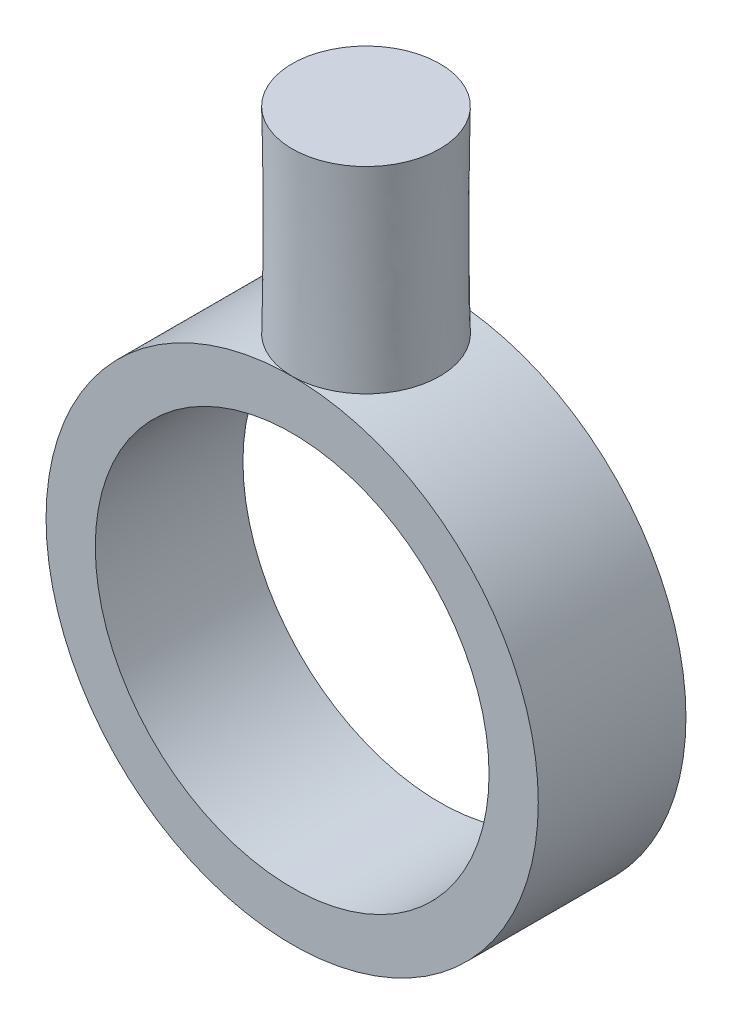
ISO-10303-21;
HEADER;
FILE_DESCRIPTION(('STEP AP214'),'2;1');
FILE_NAME('part.step','',(''),(''),'','','');
FILE_SCHEMA(('AUTOMOTIVE_DESIGN { 1 0 10303 214 1 1 1 1 }'));
ENDSEC;
DATA;
#1=APPLICATION_CONTEXT('core data for automotive mechanical design processes');
#2=APPLICATION_PROTOCOL_DEFINITION('international standard','automotive_design',2000,#1);
#3=PRODUCT_CONTEXT('',#1,'mechanical');
#4=PRODUCT('Part','Part','',(#3));
#5=PRODUCT_RELATED_PRODUCT_CATEGORY('part','',(#4));
#6=PRODUCT_DEFINITION_FORMATION('','',#4);
#7=PRODUCT_DEFINITION_CONTEXT('part definition',#1,'design');
#8=PRODUCT_DEFINITION('design','',#6,#7);
#9=PRODUCT_DEFINITION_SHAPE('','',#8);
#10=(LENGTH_UNIT() NAMED_UNIT(*) SI_UNIT(.MILLI.,.METRE.));
#11=(NAMED_UNIT(*) PLANE_ANGLE_UNIT() SI_UNIT($,.RADIAN.));
#12=(NAMED_UNIT(*) SI_UNIT($,.STERADIAN.) SOLID_ANGLE_UNIT());
#13=UNCERTAINTY_MEASURE_WITH_UNIT(LENGTH_MEASURE(1.E-05),#10,'distance_accuracy_value','');
#14=(GEOMETRIC_REPRESENTATION_CONTEXT(3) GLOBAL_UNCERTAINTY_ASSIGNED_CONTEXT((#13)) GLOBAL_UNIT_ASSIGNED_CONTEXT((#10,
#11,#12)) REPRESENTATION_CONTEXT('',''));
#15=CARTESIAN_POINT('',(0.,0.,0.));
#16=DIRECTION('',(0.,0.,1.));
#17=DIRECTION('',(1.,0.,0.));
#18=AXIS2_PLACEMENT_3D('',#15,#16,#17);
#19=CARTESIAN_POINT('',(0.,50.,15.));
#20=DIRECTION('',(0.,1.,0.));
#21=DIRECTION('',(0.,0.,1.));
#22=AXIS2_PLACEMENT_3D('',#19,#20,#21);
#23=PLANE('',#22);
#24=CARTESIAN_POINT('',(0.,50.,15.));
#25=DIRECTION('',(0.,1.,0.));
#26=DIRECTION('',(0.,0.,1.));
#27=AXIS2_PLACEMENT_3D('',#24,#25,#26);
#28=CIRCLE('',#27,15.);
#29=CARTESIAN_POINT('',(12.0178672783823,50.,6.02387243410683));
#30=VERTEX_POINT('',#29);
#31=EDGE_CURVE('E12',#30,#30,#28,.T.);
#32=ORIENTED_EDGE('',*,*,#31,.F.);
#33=EDGE_LOOP('',(#32));
#34=FACE_BOUND('',#33,.T.);
#35=ADVANCED_FACE('F47',(#34),#23,.F.);
#36=CARTESIAN_POINT('',(0.,90.,15.));
#37=DIRECTION('',(0.,1.,0.));
#38=DIRECTION('',(0.,0.,1.));
#39=AXIS2_PLACEMENT_3D('',#36,#37,#38);
#40=PLANE('',#39);
#41=CARTESIAN_POINT('',(0.,90.,15.));
#42=DIRECTION('',(0.,1.,0.));
#43=DIRECTION('',(0.,0.,1.));
#44=AXIS2_PLACEMENT_3D('',#41,#42,#43);
#45=CIRCLE('',#44,15.);
#46=CARTESIAN_POINT('',(8.36878401168276,90.,2.55156820455673));
#47=VERTEX_POINT('',#46);
#48=EDGE_CURVE('E55',#47,#47,#45,.T.);
#49=ORIENTED_EDGE('',*,*,#48,.T.);
#50=EDGE_LOOP('',(#49));
#51=FACE_BOUND('',#50,.T.);
#52=ADVANCED_FACE('F79',(#51),#40,.T.);
#53=CARTESIAN_POINT('',(8.36878401168276,90.,2.55156820455673));
#54=CARTESIAN_POINT('',(12.0178672783823,50.,6.02387243410683));
#55=CARTESIAN_POINT('',(33.2656476025693,90.,19.2891362279222));
#56=CARTESIAN_POINT('',(29.9701224101687,50.,30.0596069908715));
#57=CARTESIAN_POINT('',(16.5280795792038,90.,44.1859998188088));
#58=CARTESIAN_POINT('',(5.93438785340399,50.,48.0118621226578));
#59=CARTESIAN_POINT('',(-8.36878401168276,90.,27.4484317954433));
#60=CARTESIAN_POINT('',(-12.0178672783823,50.,23.9761275658932));
#61=CARTESIAN_POINT('',(-33.2656476025693,90.,10.7108637720778));
#62=CARTESIAN_POINT('',(-29.9701224101687,50.,-0.0596069908715031));
#63=CARTESIAN_POINT('',(-16.5280795792038,90.,-14.1859998188088));
#64=CARTESIAN_POINT('',(-5.934387853404,50.,-18.0118621226578));
#65=CARTESIAN_POINT('',(8.36878401168276,90.,2.55156820455673));
#66=CARTESIAN_POINT('',(12.0178672783823,50.,6.02387243410683));
#67=(BOUNDED_SURFACE() B_SPLINE_SURFACE(3,1,((#53,#54),(#55,#56),(#57,#58),(#59,#60),(#61,#62),
(#63,#64),(#65,#66)),.UNSPECIFIED.,.T.,.F.,.F.) B_SPLINE_SURFACE_WITH_KNOTS((4,3,4),(2,2),(0.,
0.5,1.),(0.,1.),.UNSPECIFIED.) GEOMETRIC_REPRESENTATION_ITEM() RATIONAL_B_SPLINE_SURFACE(((1.,
1.),(0.333333333333333,0.333333333333333),(0.333333333333333,0.333333333333333),(1.,1.),
(0.333333333333334,0.333333333333333),(0.333333333333334,0.333333333333333),(1.,1.))) REPRESENTATION_ITEM('') SURFACE());
#68=CARTESIAN_POINT('',(8.36878401168276,90.,2.55156820455673));
#69=CARTESIAN_POINT('',(8.40679529571088,89.5833333333333,2.58773804028121));
#70=CARTESIAN_POINT('',(8.444806579739,89.1666666666667,2.62390787600569));
#71=CARTESIAN_POINT('',(8.52082914779524,88.3333333333333,2.69624754745465));
#72=CARTESIAN_POINT('',(8.55884043182336,87.9166666666667,2.73241738317913));
#73=CARTESIAN_POINT('',(8.6348629998796,87.0833333333333,2.80475705462809));
#74=CARTESIAN_POINT('',(8.67287428390772,86.6666666666667,2.84092689035257));
#75=CARTESIAN_POINT('',(8.74889685196397,85.8333333333333,2.91326656180153));
#76=CARTESIAN_POINT('',(8.78690813599209,85.4166666666667,2.94943639752601));
#77=CARTESIAN_POINT('',(8.86293070404833,84.5833333333333,3.02177606897497));
#78=CARTESIAN_POINT('',(8.90094198807645,84.1666666666667,3.05794590469945));
#79=CARTESIAN_POINT('',(8.97696455613269,83.3333333333333,3.13028557614841));
#80=CARTESIAN_POINT('',(9.01497584016081,82.9166666666667,3.16645541187289));
#81=CARTESIAN_POINT('',(9.09099840821705,82.0833333333334,3.23879508332185));
#82=CARTESIAN_POINT('',(9.12900969224517,81.6666666666667,3.27496491904633));
#83=CARTESIAN_POINT('',(9.20503226030141,80.8333333333333,3.34730459049529));
#84=CARTESIAN_POINT('',(9.24304354432953,80.4166666666667,3.38347442621977));
#85=CARTESIAN_POINT('',(9.31906611238577,79.5833333333333,3.45581409766873));
#86=CARTESIAN_POINT('',(9.35707739641389,79.1666666666667,3.49198393339322));
#87=CARTESIAN_POINT('',(9.43309996447014,78.3333333333334,3.56432360484218));
#88=CARTESIAN_POINT('',(9.47111124849826,77.9166666666667,3.60049344056666));
#89=CARTESIAN_POINT('',(9.5471338165545,77.0833333333334,3.67283311201562));
#90=CARTESIAN_POINT('',(9.58514510058262,76.6666666666667,3.7090029477401));
#91=CARTESIAN_POINT('',(9.66116766863886,75.8333333333333,3.78134261918906));
#92=CARTESIAN_POINT('',(9.69917895266698,75.4166666666667,3.81751245491354));
#93=CARTESIAN_POINT('',(9.77520152072322,74.5833333333333,3.8898521263625));
#94=CARTESIAN_POINT('',(9.81321280475134,74.1666666666667,3.92602196208698));
#95=CARTESIAN_POINT('',(9.88923537280758,73.3333333333333,3.99836163353594));
#96=CARTESIAN_POINT('',(9.9272466568357,72.9166666666667,4.03453146926042));
#97=CARTESIAN_POINT('',(10.0032692248919,72.0833333333333,4.10687114070938));
#98=CARTESIAN_POINT('',(10.0412805089201,71.6666666666667,4.14304097643386));
#99=CARTESIAN_POINT('',(10.1173030769763,70.8333333333333,4.21538064788282));
#100=CARTESIAN_POINT('',(10.1553143610044,70.4166666666667,4.2515504836073));
#101=CARTESIAN_POINT('',(10.2313369290607,69.5833333333333,4.32389015505626));
#102=CARTESIAN_POINT('',(10.2693482130888,69.1666666666667,4.36005999078074));
#103=CARTESIAN_POINT('',(10.345370781145,68.3333333333333,4.4323996622297));
#104=CARTESIAN_POINT('',(10.3833820651731,67.9166666666667,4.46856949795418));
#105=CARTESIAN_POINT('',(10.4594046332294,67.0833333333333,4.54090916940314));
#106=CARTESIAN_POINT('',(10.4974159172575,66.6666666666667,4.57707900512762));
#107=CARTESIAN_POINT('',(10.5734384853138,65.8333333333333,4.64941867657658));
#108=CARTESIAN_POINT('',(10.6114497693419,65.4166666666667,4.68558851230106));
#109=CARTESIAN_POINT('',(10.6874723373981,64.5833333333333,4.75792818375002));
#110=CARTESIAN_POINT('',(10.7254836214262,64.1666666666667,4.79409801947451));
#111=CARTESIAN_POINT('',(10.8015061894825,63.3333333333333,4.86643769092347));
#112=CARTESIAN_POINT('',(10.8395174735106,62.9166666666667,4.90260752664795));
#113=CARTESIAN_POINT('',(10.9155400415668,62.0833333333333,4.97494719809691));
#114=CARTESIAN_POINT('',(10.953551325595,61.6666666666667,5.01111703382139));
#115=CARTESIAN_POINT('',(11.0295738936512,60.8333333333333,5.08345670527035));
#116=CARTESIAN_POINT('',(11.0675851776793,60.4166666666667,5.11962654099483));
#117=CARTESIAN_POINT('',(11.1436077457356,59.5833333333333,5.19196621244379));
#118=CARTESIAN_POINT('',(11.1816190297637,59.1666666666667,5.22813604816827));
#119=CARTESIAN_POINT('',(11.2576415978199,58.3333333333333,5.30047571961723));
#120=CARTESIAN_POINT('',(11.295652881848,57.9166666666667,5.33664555534171));
#121=CARTESIAN_POINT('',(11.3716754499043,57.0833333333333,5.40898522679067));
#122=CARTESIAN_POINT('',(11.4096867339324,56.6666666666667,5.44515506251515));
#123=CARTESIAN_POINT('',(11.4857093019886,55.8333333333333,5.51749473396411));
#124=CARTESIAN_POINT('',(11.5237205860168,55.4166666666667,5.55366456968859));
#125=CARTESIAN_POINT('',(11.599743154073,54.5833333333333,5.62600424113755));
#126=CARTESIAN_POINT('',(11.6377544381011,54.1666666666667,5.66217407686203));
#127=CARTESIAN_POINT('',(11.7137770061574,53.3333333333333,5.73451374831099));
#128=CARTESIAN_POINT('',(11.7517882901855,52.9166666666667,5.77068358403547));
#129=CARTESIAN_POINT('',(11.8278108582417,52.0833333333333,5.84302325548443));
#130=CARTESIAN_POINT('',(11.8658221422699,51.6666666666667,5.87919309120891));
#131=CARTESIAN_POINT('',(11.9418447103261,50.8333333333333,5.95153276265787));
#132=CARTESIAN_POINT('',(11.9798559943542,50.4166666666667,5.98770259838235));
#133=CARTESIAN_POINT('',(12.0178672783823,50.,6.02387243410683));
#134=B_SPLINE_CURVE_WITH_KNOTS('',3,(#68,#69,#70,#71,#72,#73,#74,#75,#76,#77,#78,#79,#80,#81,
#82,#83,#84,#85,#86,#87,#88,#89,#90,#91,#92,#93,#94,#95,#96,#97,#98,#99,#100,#101,#102,#103,
#104,#105,#106,#107,#108,#109,#110,#111,#112,#113,#114,#115,#116,#117,#118,#119,#120,#121,#122,
#123,#124,#125,#126,#127,#128,#129,#130,#131,#132,#133),.UNSPECIFIED.,.F.,.F.,(4,2,2,2,2,2,2,2,
2,2,2,2,2,2,2,2,2,2,2,2,2,2,2,2,2,2,2,2,2,2,2,2,4),(0.,1.25987222866774,2.51974445733548,
3.77961668600323,5.03948891467096,6.29936114333871,7.55923337200644,8.81910560067418,
10.0789778293419,11.3388500580097,12.5987222866774,13.8585945153452,15.1184667440129,
16.3783389726806,17.6382112013484,18.8980834300161,20.1579556586839,21.4178278873516,
22.6777001160194,23.9375723446871,25.1974445733548,26.4573168020226,27.7171890306903,
28.9770612593581,30.2369334880258,31.4968057166935,32.7566779453613,34.016550174029,
35.2764224026968,36.5362946313645,37.7961668600322,39.0560390887,40.3159113173677),.UNSPECIFIED.);
#135=EDGE_CURVE('BSEAM87',#47,#30,#134,.T.);
#136=ORIENTED_EDGE('',*,*,#48,.F.);
#137=ORIENTED_EDGE('',*,*,#31,.T.);
#138=ORIENTED_EDGE('',*,*,#135,.T.);
#139=ORIENTED_EDGE('',*,*,#135,.F.);
#140=EDGE_LOOP('',(#136,#138,#137,#139));
#141=FACE_BOUND('',#140,.T.);
#142=ADVANCED_FACE('F87',(#141),#67,.T.);
#143=CLOSED_SHELL('',(#35,#52,#142));
#144=MANIFOLD_SOLID_BREP('B2',#143);
#145=CARTESIAN_POINT('',(0.,0.,30.));
#146=DIRECTION('',(0.,0.,1.));
#147=DIRECTION('',(1.,0.,0.));
#148=AXIS2_PLACEMENT_3D('',#145,#146,#147);
#149=PLANE('',#148);
#150=CARTESIAN_POINT('',(0.,0.,30.));
#151=DIRECTION('',(0.,0.,1.));
#152=DIRECTION('',(1.,0.,0.));
#153=AXIS2_PLACEMENT_3D('',#150,#151,#152);
#154=CIRCLE('',#153,50.);
#155=CARTESIAN_POINT('',(50.,0.,30.));
#156=VERTEX_POINT('',#155);
#157=EDGE_CURVE('E46',#156,#156,#154,.T.);
#158=ORIENTED_EDGE('',*,*,#157,.T.);
#159=EDGE_LOOP('',(#158));
#160=FACE_BOUND('',#159,.T.);
#161=CARTESIAN_POINT('',(0.,0.,30.));
#162=DIRECTION('',(0.,0.,1.));
#163=DIRECTION('',(1.,0.,0.));
#164=AXIS2_PLACEMENT_3D('',#161,#162,#163);
#165=CIRCLE('',#164,40.);
#166=CARTESIAN_POINT('',(40.,0.,30.));
#167=VERTEX_POINT('',#166);
#168=EDGE_CURVE('E150',#167,#167,#165,.T.);
#169=ORIENTED_EDGE('',*,*,#168,.F.);
#170=EDGE_LOOP('',(#169));
#171=FACE_BOUND('',#170,.T.);
#172=ADVANCED_FACE('F139',(#160,#171),#149,.T.);
#173=CARTESIAN_POINT('',(0.,0.,0.));
#174=DIRECTION('',(0.,0.,1.));
#175=DIRECTION('',(1.,0.,0.));
#176=AXIS2_PLACEMENT_3D('',#173,#174,#175);
#177=PLANE('',#176);
#178=CARTESIAN_POINT('',(0.,0.,0.));
#179=DIRECTION('',(0.,0.,1.));
#180=DIRECTION('',(1.,0.,0.));
#181=AXIS2_PLACEMENT_3D('',#178,#179,#180);
#182=CIRCLE('',#181,50.);
#183=CARTESIAN_POINT('',(50.,0.,0.));
#184=VERTEX_POINT('',#183);
#185=EDGE_CURVE('E143',#184,#184,#182,.T.);
#186=ORIENTED_EDGE('',*,*,#185,.F.);
#187=EDGE_LOOP('',(#186));
#188=FACE_BOUND('',#187,.T.);
#189=CARTESIAN_POINT('',(0.,0.,0.));
#190=DIRECTION('',(0.,0.,1.));
#191=DIRECTION('',(1.,0.,0.));
#192=AXIS2_PLACEMENT_3D('',#189,#190,#191);
#193=CIRCLE('',#192,40.);
#194=CARTESIAN_POINT('',(40.,0.,0.));
#195=VERTEX_POINT('',#194);
#196=EDGE_CURVE('E152',#195,#195,#193,.T.);
#197=ORIENTED_EDGE('',*,*,#196,.T.);
#198=EDGE_LOOP('',(#197));
#199=FACE_BOUND('',#198,.T.);
#200=ADVANCED_FACE('F162',(#188,#199),#177,.F.);
#201=CARTESIAN_POINT('',(0.,0.,30.));
#202=DIRECTION('',(0.,0.,-1.));
#203=DIRECTION('',(-1.,0.,0.));
#204=AXIS2_PLACEMENT_3D('',#201,#202,#203);
#205=CYLINDRICAL_SURFACE('',#204,50.);
#206=ORIENTED_EDGE('',*,*,#157,.F.);
#207=EDGE_LOOP('',(#206));
#208=FACE_BOUND('',#207,.T.);
#209=ORIENTED_EDGE('',*,*,#185,.T.);
#210=EDGE_LOOP('',(#209));
#211=FACE_BOUND('',#210,.T.);
#212=ADVANCED_FACE('F141',(#208,#211),#205,.T.);
#213=CARTESIAN_POINT('',(0.,0.,30.));
#214=DIRECTION('',(0.,0.,-1.));
#215=DIRECTION('',(-1.,0.,0.));
#216=AXIS2_PLACEMENT_3D('',#213,#214,#215);
#217=CYLINDRICAL_SURFACE('',#216,40.);
#218=ORIENTED_EDGE('',*,*,#168,.T.);
#219=EDGE_LOOP('',(#218));
#220=FACE_BOUND('',#219,.T.);
#221=ORIENTED_EDGE('',*,*,#196,.F.);
#222=EDGE_LOOP('',(#221));
#223=FACE_BOUND('',#222,.T.);
#224=ADVANCED_FACE('F158',(#220,#223),#217,.F.);
#225=CLOSED_SHELL('',(#172,#200,#212,#224));
#226=MANIFOLD_SOLID_BREP('B7',#225);
#227=ADVANCED_BREP_SHAPE_REPRESENTATION('',(#18,#144,#226),#14);
#228=SHAPE_DEFINITION_REPRESENTATION(#9,#227);
ENDSEC;
END-ISO-10303-21;
